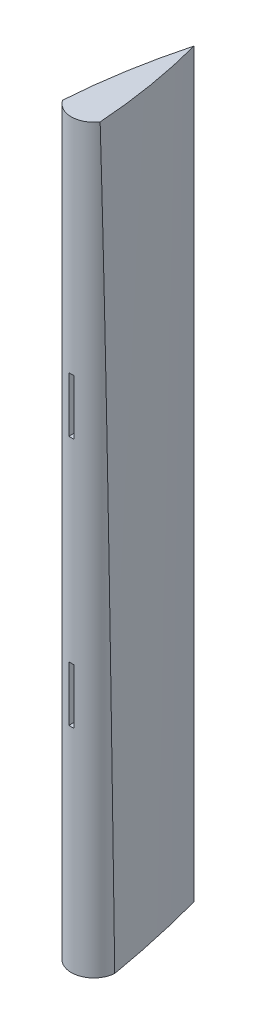
ISO-10303-21;
HEADER;
FILE_DESCRIPTION(('STEP AP214'),'2;1');
FILE_NAME('part.step','',(''),(''),'','','');
FILE_SCHEMA(('AUTOMOTIVE_DESIGN { 1 0 10303 214 1 1 1 1 }'));
ENDSEC;
DATA;
#1=APPLICATION_CONTEXT('core data for automotive mechanical design processes');
#2=APPLICATION_PROTOCOL_DEFINITION('international standard','automotive_design',2000,#1);
#3=PRODUCT_CONTEXT('',#1,'mechanical');
#4=PRODUCT('Part','Part','',(#3));
#5=PRODUCT_RELATED_PRODUCT_CATEGORY('part','',(#4));
#6=PRODUCT_DEFINITION_FORMATION('','',#4);
#7=PRODUCT_DEFINITION_CONTEXT('part definition',#1,'design');
#8=PRODUCT_DEFINITION('design','',#6,#7);
#9=PRODUCT_DEFINITION_SHAPE('','',#8);
#10=(LENGTH_UNIT() NAMED_UNIT(*) SI_UNIT(.MILLI.,.METRE.));
#11=(NAMED_UNIT(*) PLANE_ANGLE_UNIT() SI_UNIT($,.RADIAN.));
#12=(NAMED_UNIT(*) SI_UNIT($,.STERADIAN.) SOLID_ANGLE_UNIT());
#13=UNCERTAINTY_MEASURE_WITH_UNIT(LENGTH_MEASURE(1.E-05),#10,'distance_accuracy_value','');
#14=(GEOMETRIC_REPRESENTATION_CONTEXT(3) GLOBAL_UNCERTAINTY_ASSIGNED_CONTEXT((#13)) GLOBAL_UNIT_ASSIGNED_CONTEXT((#10,
#11,#12)) REPRESENTATION_CONTEXT('',''));
#15=CARTESIAN_POINT('',(0.,0.,0.));
#16=DIRECTION('',(0.,0.,1.));
#17=DIRECTION('',(1.,0.,0.));
#18=AXIS2_PLACEMENT_3D('',#15,#16,#17);
#19=CARTESIAN_POINT('',(0.,170.,96.5));
#20=DIRECTION('',(0.,1.,0.));
#21=DIRECTION('',(0.,0.,1.));
#22=AXIS2_PLACEMENT_3D('',#19,#20,#21);
#23=PLANE('',#22);
#24=CARTESIAN_POINT('',(0.,170.,86.5));
#25=DIRECTION('',(0.,-1.,0.));
#26=DIRECTION('',(0.,0.,-1.));
#27=AXIS2_PLACEMENT_3D('',#24,#25,#26);
#28=CIRCLE('',#27,4.50445274350269);
#29=CARTESIAN_POINT('',(3.74973564692036,170.,88.9959120771101));
#30=VERTEX_POINT('',#29);
#31=CARTESIAN_POINT('',(-3.74973564692016,170.,88.9959120771104));
#32=VERTEX_POINT('',#31);
#33=EDGE_CURVE('E266',#30,#32,#28,.T.);
#34=ORIENTED_EDGE('',*,*,#33,.F.);
#35=CARTESIAN_POINT('',(4.,170.,96.5));
#36=CARTESIAN_POINT('',(4.,170.,81.5));
#37=CARTESIAN_POINT('',(0.,170.,66.5));
#38=B_SPLINE_CURVE_WITH_KNOTS('',2,(#35,#36,#37),.UNSPECIFIED.,.F.,.F.,(3,3),(0.,1.),.UNSPECIFIED.);
#39=CARTESIAN_POINT('',(0.,170.,66.5));
#40=VERTEX_POINT('',#39);
#41=EDGE_CURVE('E215',#30,#40,#38,.T.);
#42=ORIENTED_EDGE('',*,*,#41,.T.);
#43=CARTESIAN_POINT('',(-4.,170.,96.5));
#44=CARTESIAN_POINT('',(-4.,170.,81.5));
#45=CARTESIAN_POINT('',(0.,170.,66.5));
#46=B_SPLINE_CURVE_WITH_KNOTS('',2,(#43,#44,#45),.UNSPECIFIED.,.F.,.F.,(3,3),(0.,1.),.UNSPECIFIED.);
#47=EDGE_CURVE('E214',#32,#40,#46,.T.);
#48=ORIENTED_EDGE('',*,*,#47,.F.);
#49=EDGE_LOOP('',(#34,#42,#48));
#50=FACE_BOUND('',#49,.T.);
#51=ADVANCED_FACE('F40',(#50),#23,.T.);
#52=CARTESIAN_POINT('',(0.,20.,86.5));
#53=DIRECTION('',(0.,1.,0.));
#54=DIRECTION('',(0.,0.,1.));
#55=AXIS2_PLACEMENT_3D('',#52,#53,#54);
#56=CYLINDRICAL_SURFACE('',#55,4.50445274350269);
#57=DIRECTION('',(0.,1.,0.));
#58=VECTOR('',#57,1.);
#59=CARTESIAN_POINT('',(-0.499999999999906,20.,90.9766164140397));
#60=LINE('',#59,#58);
#61=CARTESIAN_POINT('',(-0.499999999999906,125.5,90.9766164140397));
#62=VERTEX_POINT('',#61);
#63=CARTESIAN_POINT('',(-0.499999999999906,114.5,90.9766164140397));
#64=VERTEX_POINT('',#63);
#65=EDGE_CURVE('E324',#62,#64,#60,.F.);
#66=ORIENTED_EDGE('',*,*,#65,.F.);
#67=CARTESIAN_POINT('',(0.,125.5,86.5));
#68=DIRECTION('',(0.,1.,0.));
#69=DIRECTION('',(0.,0.,1.));
#70=AXIS2_PLACEMENT_3D('',#67,#68,#69);
#71=CIRCLE('',#70,4.50445274350269);
#72=CARTESIAN_POINT('',(0.500000000000094,125.5,90.9766164140396));
#73=VERTEX_POINT('',#72);
#74=EDGE_CURVE('E11',#62,#73,#71,.T.);
#75=ORIENTED_EDGE('',*,*,#74,.T.);
#76=DIRECTION('',(0.,1.,0.));
#77=VECTOR('',#76,1.);
#78=CARTESIAN_POINT('',(0.500000000000094,20.,90.9766164140396));
#79=LINE('',#78,#77);
#80=CARTESIAN_POINT('',(0.500000000000094,114.5,90.9766164140396));
#81=VERTEX_POINT('',#80);
#82=EDGE_CURVE('E51',#73,#81,#79,.F.);
#83=ORIENTED_EDGE('',*,*,#82,.T.);
#84=CARTESIAN_POINT('',(0.,114.5,86.5));
#85=DIRECTION('',(0.,1.,0.));
#86=DIRECTION('',(0.,0.,1.));
#87=AXIS2_PLACEMENT_3D('',#84,#85,#86);
#88=CIRCLE('',#87,4.50445274350269);
#89=EDGE_CURVE('E326',#64,#81,#88,.T.);
#90=ORIENTED_EDGE('',*,*,#89,.F.);
#91=EDGE_LOOP('',(#66,#75,#83,#90));
#92=FACE_BOUND('',#91,.T.);
#93=DIRECTION('',(0.,1.,0.));
#94=VECTOR('',#93,1.);
#95=CARTESIAN_POINT('',(-0.499999999999889,20.,90.9766164140397));
#96=LINE('',#95,#94);
#97=CARTESIAN_POINT('',(-0.499999999999889,75.5,90.9766164140397));
#98=VERTEX_POINT('',#97);
#99=CARTESIAN_POINT('',(-0.49999999999989,64.5,90.9766164140397));
#100=VERTEX_POINT('',#99);
#101=EDGE_CURVE('E216',#98,#100,#96,.F.);
#102=ORIENTED_EDGE('',*,*,#101,.F.);
#103=CARTESIAN_POINT('',(0.,75.5,86.5));
#104=DIRECTION('',(0.,1.,0.));
#105=DIRECTION('',(0.,0.,1.));
#106=AXIS2_PLACEMENT_3D('',#103,#104,#105);
#107=CIRCLE('',#106,4.50445274350269);
#108=CARTESIAN_POINT('',(0.50000000000011,75.5,90.9766164140396));
#109=VERTEX_POINT('',#108);
#110=EDGE_CURVE('E319',#98,#109,#107,.T.);
#111=ORIENTED_EDGE('',*,*,#110,.T.);
#112=DIRECTION('',(0.,1.,0.));
#113=VECTOR('',#112,1.);
#114=CARTESIAN_POINT('',(0.50000000000011,20.,90.9766164140396));
#115=LINE('',#114,#113);
#116=CARTESIAN_POINT('',(0.50000000000011,64.5,90.9766164140396));
#117=VERTEX_POINT('',#116);
#118=EDGE_CURVE('E315',#109,#117,#115,.F.);
#119=ORIENTED_EDGE('',*,*,#118,.T.);
#120=CARTESIAN_POINT('',(0.,64.5,86.5));
#121=DIRECTION('',(0.,1.,0.));
#122=DIRECTION('',(0.,0.,1.));
#123=AXIS2_PLACEMENT_3D('',#120,#121,#122);
#124=CIRCLE('',#123,4.50445274350269);
#125=EDGE_CURVE('E312',#100,#117,#124,.T.);
#126=ORIENTED_EDGE('',*,*,#125,.F.);
#127=EDGE_LOOP('',(#102,#111,#119,#126));
#128=FACE_BOUND('',#127,.T.);
#129=CARTESIAN_POINT('',(0.,22.,86.5));
#130=DIRECTION('',(0.,-1.,0.));
#131=DIRECTION('',(0.,0.,-1.));
#132=AXIS2_PLACEMENT_3D('',#129,#130,#131);
#133=CIRCLE('',#132,4.50445274350269);
#134=CARTESIAN_POINT('',(4.49270552710919,22.0000000000284,86.8251023917653));
#135=VERTEX_POINT('',#134);
#136=CARTESIAN_POINT('',(-4.49270552710921,22.,86.8251023917649));
#137=VERTEX_POINT('',#136);
#138=EDGE_CURVE('E305',#135,#137,#133,.T.);
#139=ORIENTED_EDGE('',*,*,#138,.F.);
#140=CARTESIAN_POINT('',(4.49463644337586,20.,86.797216689179));
#141=CARTESIAN_POINT('',(4.49324611615135,21.5013365909766,86.8182325955692));
#142=CARTESIAN_POINT('',(4.49172184768343,23.0026757479804,86.8390546621087));
#143=CARTESIAN_POINT('',(4.48841093930421,26.0053581422894,86.8803848432464));
#144=CARTESIAN_POINT('',(4.48662429938495,27.5067013795947,86.9008929578353));
#145=CARTESIAN_POINT('',(4.48087908795766,32.010736436233,86.9620569761771));
#146=CARTESIAN_POINT('',(4.476535225656,35.0134326618934,87.0023525414618));
#147=CARTESIAN_POINT('',(4.46682299270257,41.018830496669,87.0824155689863));
#148=CARTESIAN_POINT('',(4.46145462203055,44.0215321057843,87.1221830312159));
#149=CARTESIAN_POINT('',(4.44377952498389,53.029637347885,87.2412023744453));
#150=CARTESIAN_POINT('',(4.42990281310395,59.0350417708939,87.3201712169916));
#151=CARTESIAN_POINT('',(4.4018672415971,69.4108560135893,87.4576702431264));
#152=CARTESIAN_POINT('',(4.38881373710263,73.7812726516977,87.5159116828163));
#153=CARTESIAN_POINT('',(4.35988918217684,82.5220801104054,87.6336406669034));
#154=CARTESIAN_POINT('',(4.3440181316633,86.8924709310038,87.6931282113369));
#155=CARTESIAN_POINT('',(4.30902421573481,95.6332205702791,87.8139091254271));
#156=CARTESIAN_POINT('',(4.28990134601869,100.003579388906,87.8752024974724));
#157=CARTESIAN_POINT('',(4.24783410460643,108.744245323533,88.0001151283537));
#158=CARTESIAN_POINT('',(4.22488973322412,113.114552439537,88.0637343869988));
#159=CARTESIAN_POINT('',(4.17444346589508,121.854569740538,88.1938076132548));
#160=CARTESIAN_POINT('',(4.14694212161807,126.224279933791,88.2602612370136));
#161=CARTESIAN_POINT('',(4.08641679578091,134.963611400471,88.3965377746959));
#162=CARTESIAN_POINT('',(4.05339281273624,139.333232673873,88.4663606895251));
#163=CARTESIAN_POINT('',(3.980557119153,148.072343289656,88.609915376404));
#164=CARTESIAN_POINT('',(3.94074542679791,152.441832632358,88.683647137982));
#165=CARTESIAN_POINT('',(3.85265712254613,161.180647711731,88.8355623928345));
#166=CARTESIAN_POINT('',(3.80438051765123,165.549973448534,88.9137458824267));
#167=CARTESIAN_POINT('',(3.75040523683738,169.946124169629,88.9949058950007));
#168=CARTESIAN_POINT('',(3.75007429301951,169.973062086965,88.9954033065976));
#169=CARTESIAN_POINT('',(3.74974314488905,170.,88.9959008124937));
#170=B_SPLINE_CURVE_WITH_KNOTS('',3,(#140,#141,#142,#143,#144,#145,#146,#147,#148,#149,#150,
#151,#152,#153,#154,#155,#156,#157,#158,#159,#160,#161,#162,#163,#164,#165,#166,#167,#168,#169),
.UNSPECIFIED.,.F.,.F.,(4,2,2,2,2,2,2,2,2,2,2,2,2,2,4),(0.,4.50445290300543,9.00890594252304,
18.0178148370163,27.0267239095406,45.0445409286816,58.1570126515752,71.2694847571101,
84.3819742065918,97.4944625792762,110.605364704911,123.716270354844,136.82714088278,
149.938000566049,150.018834191428),.UNSPECIFIED.);
#171=EDGE_CURVE('E271',#135,#30,#170,.T.);
#172=ORIENTED_EDGE('',*,*,#171,.T.);
#173=ORIENTED_EDGE('',*,*,#33,.T.);
#174=CARTESIAN_POINT('',(-3.74974314488914,170.,88.9959008124933));
#175=CARTESIAN_POINT('',(-3.76819510449323,168.498884020559,88.9681770972164));
#176=CARTESIAN_POINT('',(-3.78601169028676,166.997754969201,88.9407461706218));
#177=CARTESIAN_POINT('',(-3.8204696883343,163.995473607015,88.8864496106249));
#178=CARTESIAN_POINT('',(-3.83711110095252,162.494321296193,88.8595839770472));
#179=CARTESIAN_POINT('',(-3.8854160716347,157.990821680486,88.7798043741134));
#180=CARTESIAN_POINT('',(-3.915460232064,154.988442416944,88.7277079003352));
#181=CARTESIAN_POINT('',(-3.97185615517319,148.983614867033,88.6255228862658));
#182=CARTESIAN_POINT('',(-3.99820791696678,145.981166580648,88.5754343464565));
#183=CARTESIAN_POINT('',(-4.07252097185096,136.973731880631,88.4279153174129));
#184=CARTESIAN_POINT('',(-4.11573997857941,130.968661020375,88.3332315134902));
#185=CARTESIAN_POINT('',(-4.17912139538496,121.067572771949,88.1820097737817));
#186=CARTESIAN_POINT('',(-4.20205035108585,117.171598230993,88.1237543648514));
#187=CARTESIAN_POINT('',(-4.24448196812442,109.37959885702,88.0093702503424));
#188=CARTESIAN_POINT('',(-4.2639846292016,105.483574023999,87.9532415449254));
#189=CARTESIAN_POINT('',(-4.30005837331471,97.6914858637677,87.8427458521934));
#190=CARTESIAN_POINT('',(-4.31662945620337,93.7954225365549,87.7883788649669));
#191=CARTESIAN_POINT('',(-4.34722517752018,86.0032669470963,87.6810342149983));
#192=CARTESIAN_POINT('',(-4.36124981601423,82.1071746848512,87.6280565522201));
#193=CARTESIAN_POINT('',(-4.39022239493888,73.3601666444535,87.5102346909263));
#194=CARTESIAN_POINT('',(-4.4045543220063,68.5092451586463,87.4456641074348));
#195=CARTESIAN_POINT('',(-4.43018285493534,58.8073847035413,87.3172304124278));
#196=CARTESIAN_POINT('',(-4.44147946066184,53.9564457342429,87.2533673009439));
#197=CARTESIAN_POINT('',(-4.45635086284768,46.6800406023461,87.1573249940805));
#198=CARTESIAN_POINT('',(-4.46096240941608,44.2545748772233,87.125269646361));
#199=CARTESIAN_POINT('',(-4.46951110352355,39.4036455662924,87.0609094760222));
#200=CARTESIAN_POINT('',(-4.4734482510703,36.9781819804842,87.0286046534056));
#201=CARTESIAN_POINT('',(-4.4806568849815,32.1272598874642,86.9635542483466));
#202=CARTESIAN_POINT('',(-4.48392837139554,29.701801380252,86.9308086659371));
#203=CARTESIAN_POINT('',(-4.4897936682541,24.8508931152665,86.8646099937506));
#204=CARTESIAN_POINT('',(-4.49238747867073,22.4254433574934,86.8311569039446));
#205=CARTESIAN_POINT('',(-4.49463644337586,20.,86.797216689179));
#206=B_SPLINE_CURVE_WITH_KNOTS('',3,(#174,#175,#176,#177,#178,#179,#180,#181,#182,#183,#184,
#185,#186,#187,#188,#189,#190,#191,#192,#193,#194,#195,#196,#197,#198,#199,#200,#201,#202,#203,
#204,#205),.UNSPECIFIED.,.F.,.F.,(4,2,2,2,2,2,2,2,2,2,2,2,2,2,2,4),(0.,4.50445565239495,
9.00890990876309,18.0178506030638,27.0267934598059,45.0446953593323,56.7341262935253,
68.4235581164091,80.1129905265462,91.8024226341653,106.356538548724,120.910655111136,
128.187700800217,135.464746406541,142.741791470756,150.018836834383),.UNSPECIFIED.);
#207=EDGE_CURVE('E240',#32,#137,#206,.T.);
#208=ORIENTED_EDGE('',*,*,#207,.T.);
#209=EDGE_LOOP('',(#139,#172,#173,#208));
#210=FACE_BOUND('',#209,.T.);
#211=ADVANCED_FACE('F200',(#92,#128,#210),#56,.T.);
#212=CARTESIAN_POINT('',(0.,0.,66.5));
#213=CARTESIAN_POINT('',(0.,56.6666666666667,66.5));
#214=CARTESIAN_POINT('',(0.,113.333333333333,66.5));
#215=CARTESIAN_POINT('',(0.,170.,66.5));
#216=CARTESIAN_POINT('',(-1.30245716316965,0.,71.3028107891881));
#217=CARTESIAN_POINT('',(-1.08554198762785,56.6666666666667,70.5165134051391));
#218=CARTESIAN_POINT('',(-0.868626812086048,113.333333333333,69.73021602109));
#219=CARTESIAN_POINT('',(-0.651711636544246,170.,68.943918637041));
#220=CARTESIAN_POINT('',(-3.60999981867831,0.,80.98563710704));
#221=CARTESIAN_POINT('',(-3.00892422202832,56.6666666666667,78.6148522260634));
#222=CARTESIAN_POINT('',(-2.40784862537832,113.333333333333,76.2440673450868));
#223=CARTESIAN_POINT('',(-1.80677302872833,170.,73.8732824641101));
#224=CARTESIAN_POINT('',(-6.12693045498558,0.,95.700940806144));
#225=CARTESIAN_POINT('',(-5.10655083308295,56.6666666666667,90.9220308440304));
#226=CARTESIAN_POINT('',(-4.08617121118032,113.333333333333,86.1431208819168));
#227=CARTESIAN_POINT('',(-3.06579158927769,170.,81.3642109198033));
#228=CARTESIAN_POINT('',(-7.6571301959301,0.,110.557077232018));
#229=CARTESIAN_POINT('',(-6.38129393365213,56.6666666666666,103.344453572357));
#230=CARTESIAN_POINT('',(-5.10545767137415,113.333333333333,96.1318299126951));
#231=CARTESIAN_POINT('',(-3.82962140909618,170.,88.9192062530334));
#232=CARTESIAN_POINT('',(-8.,0.,120.516654934178));
#233=CARTESIAN_POINT('',(-6.66666666666667,56.6666666666667,111.669189393747));
#234=CARTESIAN_POINT('',(-5.33333333333333,113.333333333333,102.821723853316));
#235=CARTESIAN_POINT('',(-4.,170.,93.9742583128852));
#236=CARTESIAN_POINT('',(-8.,0.,126.540134839831));
#237=CARTESIAN_POINT('',(-6.66666666666667,56.6666666666667,116.702482696347));
#238=CARTESIAN_POINT('',(-5.33333333333333,113.333333333333,106.864830552862));
#239=CARTESIAN_POINT('',(-4.,170.,97.027178409378));
#240=CARTESIAN_POINT('',(-7.58920231771033,0.,128.627479332831));
#241=CARTESIAN_POINT('',(-6.32256414699206,56.6666666666667,118.444155574602));
#242=CARTESIAN_POINT('',(-5.05592597627379,113.333333333333,108.260831816373));
#243=CARTESIAN_POINT('',(-3.78928780555552,170.,98.0775080581438));
#244=CARTESIAN_POINT('',(-5.81336309831473,0.,131.296468991079));
#245=CARTESIAN_POINT('',(-4.84143972386072,56.6666666666666,120.666310102981));
#246=CARTESIAN_POINT('',(-3.86951634940672,113.333333333333,110.036151214882));
#247=CARTESIAN_POINT('',(-2.89759297495271,170.,99.4059923267827));
#248=CARTESIAN_POINT('',(-3.14498817547013,0.,133.083551957018));
#249=CARTESIAN_POINT('',(-2.61957745119133,56.6666666666667,122.153083212068));
#250=CARTESIAN_POINT('',(-2.09416672691253,113.333333333333,111.222614467118));
#251=CARTESIAN_POINT('',(-1.56875600263372,170.,100.292145722168));
#252=CARTESIAN_POINT('',(-1.04719754438289,0.,133.5));
#253=CARTESIAN_POINT('',(-0.872664620319073,56.6666666666667,122.5));
#254=CARTESIAN_POINT('',(-0.698131696255256,113.333333333333,111.5));
#255=CARTESIAN_POINT('',(-0.52359877219144,170.,100.5));
#256=CARTESIAN_POINT('',(0.,0.,133.5));
#257=CARTESIAN_POINT('',(0.,56.6666666666667,122.5));
#258=CARTESIAN_POINT('',(0.,113.333333333333,111.5));
#259=CARTESIAN_POINT('',(0.,170.,100.5));
#260=B_SPLINE_SURFACE_WITH_KNOTS('',3,3,((#212,#213,#214,#215),(#216,#217,#218,#219),(#220,#221,
#222,#223),(#224,#225,#226,#227),(#228,#229,#230,#231),(#232,#233,#234,#235),(#236,#237,#238,
#239),(#240,#241,#242,#243),(#244,#245,#246,#247),(#248,#249,#250,#251),(#252,#253,#254,#255),
(#256,#257,#258,#259)),.UNSPECIFIED.,.F.,.F.,.F.,(4,1,1,1,2,1,1,1,4),(4,4),(0.,0.10341499304136,
0.20682998608272,0.31024497912408,0.41365997216544,0.43524497912408,0.45682998608272,
0.47841499304136,0.5),(0.,1.),.UNSPECIFIED.);
#261=CARTESIAN_POINT('',(0.,0.,66.5));
#262=CARTESIAN_POINT('',(0.,56.6666666666667,66.5));
#263=CARTESIAN_POINT('',(0.,113.333333333333,66.5));
#264=CARTESIAN_POINT('',(0.,170.,66.5));
#265=B_SPLINE_CURVE_WITH_KNOTS('',3,(#261,#262,#263,#264),.UNSPECIFIED.,.F.,.F.,(4,4),(0.,1.),.UNSPECIFIED.);
#266=CARTESIAN_POINT('',(1.58957291773731E-08,22.,66.499999941243));
#267=VERTEX_POINT('',#266);
#268=EDGE_CURVE('E211',#267,#40,#265,.T.);
#269=CARTESIAN_POINT('',(0.,22.,66.5));
#270=CARTESIAN_POINT('',(-0.204196817663707,22.,67.2538591320361));
#271=CARTESIAN_POINT('',(-0.404496989936602,22.,68.0087744680544));
#272=CARTESIAN_POINT('',(-0.797111559789184,22.,69.5202211038593));
#273=CARTESIAN_POINT('',(-0.989430428358535,22.,70.2767512423231));
#274=CARTESIAN_POINT('',(-1.36603538844595,22.,71.7914390091773));
#275=CARTESIAN_POINT('',(-1.55032513484789,22.,72.5495957286923));
#276=CARTESIAN_POINT('',(-1.91082178461146,22.,74.0675483988521));
#277=CARTESIAN_POINT('',(-2.08703149320491,22.,74.8273436832158));
#278=CARTESIAN_POINT('',(-2.43131502058955,22.,76.3485860903812));
#279=CARTESIAN_POINT('',(-2.59939075933179,22.,77.1100327786097));
#280=CARTESIAN_POINT('',(-2.92735009521612,22.,78.6345913537089));
#281=CARTESIAN_POINT('',(-3.08723468934102,22.,79.3977030260821));
#282=CARTESIAN_POINT('',(-3.39875689836038,22.,80.9256257324776));
#283=CARTESIAN_POINT('',(-3.55039432956466,22.,81.6904368039563));
#284=CARTESIAN_POINT('',(-3.84537153411693,22.,83.2217454964744));
#285=CARTESIAN_POINT('',(-3.98871038596972,22.,83.9882432950403));
#286=CARTESIAN_POINT('',(-4.26704039428219,22.,85.5229339760401));
#287=CARTESIAN_POINT('',(-4.40202963705225,22.,86.2911272055814));
#288=CARTESIAN_POINT('',(-4.66360683620004,22.,87.8292178596223));
#289=CARTESIAN_POINT('',(-4.79019185324581,22.,88.5991157840591));
#290=CARTESIAN_POINT('',(-5.03490323095779,22.,90.1406257288566));
#291=CARTESIAN_POINT('',(-5.15302559086815,22.,90.9122383844513));
#292=CARTESIAN_POINT('',(-5.38075059330338,22.,92.4571878975243));
#293=CARTESIAN_POINT('',(-5.49034813555736,22.,93.2305255067282));
#294=CARTESIAN_POINT('',(-5.59561527343388,22.,94.004452743504));
#295=B_SPLINE_CURVE_WITH_KNOTS('',3,(#269,#270,#271,#272,#273,#274,#275,#276,#277,#278,#279,
#280,#281,#282,#283,#284,#285,#286,#287,#288,#289,#290,#291,#292,#293,#294),.UNSPECIFIED.,.F.,
.F.,(4,2,2,2,2,2,2,2,2,2,2,2,4),(0.,2.34306536392264,4.68479995995476,7.02545720870046,
9.36529557693775,11.7045789261459,14.0435768703932,16.3826268901414,18.7219361476925,
21.0617795918383,23.4024371187715,25.7441939974228,28.087341306642),.UNSPECIFIED.);
#296=EDGE_CURVE('E155',#267,#137,#295,.T.);
#297=ORIENTED_EDGE('',*,*,#268,.F.);
#298=ORIENTED_EDGE('',*,*,#296,.T.);
#299=ORIENTED_EDGE('',*,*,#207,.F.);
#300=ORIENTED_EDGE('',*,*,#47,.T.);
#301=EDGE_LOOP('',(#297,#298,#299,#300));
#302=FACE_BOUND('',#301,.T.);
#303=ADVANCED_FACE('F42',(#302),#260,.T.);
#304=CARTESIAN_POINT('',(0.,0.,133.5));
#305=CARTESIAN_POINT('',(0.,56.6666666666667,122.5));
#306=CARTESIAN_POINT('',(0.,113.333333333333,111.5));
#307=CARTESIAN_POINT('',(0.,170.,100.5));
#308=CARTESIAN_POINT('',(1.04719754438289,0.,133.5));
#309=CARTESIAN_POINT('',(0.872664620319073,56.6666666666667,122.5));
#310=CARTESIAN_POINT('',(0.698131696255257,113.333333333333,111.5));
#311=CARTESIAN_POINT('',(0.52359877219144,170.,100.5));
#312=CARTESIAN_POINT('',(3.14498817547013,0.,133.083551957018));
#313=CARTESIAN_POINT('',(2.61957745119133,56.6666666666667,122.153083212068));
#314=CARTESIAN_POINT('',(2.09416672691253,113.333333333333,111.222614467118));
#315=CARTESIAN_POINT('',(1.56875600263373,170.,100.292145722168));
#316=CARTESIAN_POINT('',(5.81336309831469,0.,131.296468991079));
#317=CARTESIAN_POINT('',(4.8414397238607,56.6666666666666,120.66631010298));
#318=CARTESIAN_POINT('',(3.86951634940671,113.333333333333,110.036151214882));
#319=CARTESIAN_POINT('',(2.89759297495271,170.,99.405992326783));
#320=CARTESIAN_POINT('',(7.58920231771033,0.,128.627479332832));
#321=CARTESIAN_POINT('',(6.32256414699206,56.6666666666667,118.444155574602));
#322=CARTESIAN_POINT('',(5.0559259762738,113.333333333333,108.260831816373));
#323=CARTESIAN_POINT('',(3.78928780555553,170.,98.0775080581436));
#324=CARTESIAN_POINT('',(8.,0.,126.540134839831));
#325=CARTESIAN_POINT('',(6.66666666666667,56.6666666666667,116.702482696347));
#326=CARTESIAN_POINT('',(5.33333333333334,113.333333333333,106.864830552862));
#327=CARTESIAN_POINT('',(4.,170.,97.0271784093779));
#328=CARTESIAN_POINT('',(8.,0.,120.516654934178));
#329=CARTESIAN_POINT('',(6.66666666666667,56.6666666666667,111.669189393747));
#330=CARTESIAN_POINT('',(5.33333333333333,113.333333333333,102.821723853316));
#331=CARTESIAN_POINT('',(4.,170.,93.9742583128852));
#332=CARTESIAN_POINT('',(7.65713019593011,0.,110.557077232018));
#333=CARTESIAN_POINT('',(6.38129393365213,56.6666666666666,103.344453572357));
#334=CARTESIAN_POINT('',(5.10545767137415,113.333333333333,96.131829912695));
#335=CARTESIAN_POINT('',(3.82962140909618,170.,88.9192062530334));
#336=CARTESIAN_POINT('',(6.12693045498559,0.,95.7009408061443));
#337=CARTESIAN_POINT('',(5.10655083308296,56.6666666666667,90.9220308440306));
#338=CARTESIAN_POINT('',(4.08617121118033,113.333333333333,86.1431208819169));
#339=CARTESIAN_POINT('',(3.0657915892777,170.,81.3642109198032));
#340=CARTESIAN_POINT('',(3.6099998186783,0.,80.9856371070398));
#341=CARTESIAN_POINT('',(3.00892422202831,56.6666666666666,78.6148522260632));
#342=CARTESIAN_POINT('',(2.40784862537832,113.333333333333,76.2440673450867));
#343=CARTESIAN_POINT('',(1.80677302872833,170.,73.8732824641101));
#344=CARTESIAN_POINT('',(1.30245716316965,0.,71.3028107891881));
#345=CARTESIAN_POINT('',(1.08554198762785,56.6666666666667,70.5165134051391));
#346=CARTESIAN_POINT('',(0.868626812086049,113.333333333333,69.73021602109));
#347=CARTESIAN_POINT('',(0.651711636544247,170.,68.943918637041));
#348=CARTESIAN_POINT('',(0.,0.,66.5));
#349=CARTESIAN_POINT('',(0.,56.6666666666667,66.5));
#350=CARTESIAN_POINT('',(0.,113.333333333333,66.5));
#351=CARTESIAN_POINT('',(0.,170.,66.5));
#352=B_SPLINE_SURFACE_WITH_KNOTS('',3,3,((#304,#305,#306,#307),(#308,#309,#310,#311),(#312,#313,
#314,#315),(#316,#317,#318,#319),(#320,#321,#322,#323),(#324,#325,#326,#327),(#328,#329,#330,
#331),(#332,#333,#334,#335),(#336,#337,#338,#339),(#340,#341,#342,#343),(#344,#345,#346,#347),
(#348,#349,#350,#351)),.UNSPECIFIED.,.F.,.F.,.F.,(4,1,1,1,2,1,1,1,4),(4,4),(0.5,
0.52158500695864,0.54317001391728,0.56475502087592,0.58634002783456,0.68975502087592,
0.79317001391728,0.89658500695864,1.),(0.,1.),.UNSPECIFIED.);
#353=CARTESIAN_POINT('',(5.59561527343387,22.,94.004452743504));
#354=CARTESIAN_POINT('',(5.49034813555734,22.,93.2305255067282));
#355=CARTESIAN_POINT('',(5.38075059330336,22.,92.4571878975243));
#356=CARTESIAN_POINT('',(5.15302559086814,22.,90.9122383844513));
#357=CARTESIAN_POINT('',(5.03490323095778,22.,90.1406257288566));
#358=CARTESIAN_POINT('',(4.79019185324581,22.,88.5991157840591));
#359=CARTESIAN_POINT('',(4.66360683620004,22.,87.8292178596223));
#360=CARTESIAN_POINT('',(4.40202963705225,22.,86.2911272055814));
#361=CARTESIAN_POINT('',(4.26704039428218,22.,85.5229339760401));
#362=CARTESIAN_POINT('',(3.98871038596972,22.,83.9882432950404));
#363=CARTESIAN_POINT('',(3.84537153411695,22.,83.2217454964744));
#364=CARTESIAN_POINT('',(3.55039432956469,22.,81.6904368039563));
#365=CARTESIAN_POINT('',(3.3987568983604,22.,80.9256257324777));
#366=CARTESIAN_POINT('',(3.08723468934103,22.,79.3977030260821));
#367=CARTESIAN_POINT('',(2.92735009521614,22.,78.6345913537089));
#368=CARTESIAN_POINT('',(2.59939075933181,22.,77.1100327786097));
#369=CARTESIAN_POINT('',(2.43131502058956,22.,76.3485860903812));
#370=CARTESIAN_POINT('',(2.08703149320493,22.,74.8273436832158));
#371=CARTESIAN_POINT('',(1.91082178461148,22.,74.0675483988521));
#372=CARTESIAN_POINT('',(1.55032513484791,22.,72.5495957286923));
#373=CARTESIAN_POINT('',(1.36603538844596,22.,71.7914390091773));
#374=CARTESIAN_POINT('',(0.989430428358536,22.,70.2767512423231));
#375=CARTESIAN_POINT('',(0.79711155978919,22.,69.5202211038593));
#376=CARTESIAN_POINT('',(0.404496989936613,22.,68.0087744680544));
#377=CARTESIAN_POINT('',(0.204196817663718,22.,67.2538591320361));
#378=CARTESIAN_POINT('',(0.,22.,66.5));
#379=B_SPLINE_CURVE_WITH_KNOTS('',3,(#353,#354,#355,#356,#357,#358,#359,#360,#361,#362,#363,
#364,#365,#366,#367,#368,#369,#370,#371,#372,#373,#374,#375,#376,#377,#378),.UNSPECIFIED.,.F.,
.F.,(4,2,2,2,2,2,2,2,2,2,2,2,4),(0.,2.34314730921921,4.68490418787053,7.0255617148037,
9.3654051589495,11.7047144165006,14.0437644362488,16.3827623804961,18.7220457297043,
21.0618840979416,23.4025413466873,25.7442759427194,28.0873413066421),.UNSPECIFIED.);
#380=EDGE_CURVE('E272',#135,#267,#379,.T.);
#381=ORIENTED_EDGE('',*,*,#171,.F.);
#382=ORIENTED_EDGE('',*,*,#380,.T.);
#383=ORIENTED_EDGE('',*,*,#268,.T.);
#384=ORIENTED_EDGE('',*,*,#41,.F.);
#385=EDGE_LOOP('',(#381,#382,#383,#384));
#386=FACE_BOUND('',#385,.T.);
#387=ADVANCED_FACE('F186',(#386),#352,.T.);
#388=CARTESIAN_POINT('',(8.0000000000382,22.,125.499999999999));
#389=DIRECTION('',(0.,-1.,0.));
#390=DIRECTION('',(0.,0.,-1.));
#391=AXIS2_PLACEMENT_3D('',#388,#389,#390);
#392=PLANE('',#391);
#393=ORIENTED_EDGE('',*,*,#138,.T.);
#394=ORIENTED_EDGE('',*,*,#296,.F.);
#395=ORIENTED_EDGE('',*,*,#380,.F.);
#396=EDGE_LOOP('',(#393,#394,#395));
#397=FACE_BOUND('',#396,.T.);
#398=ADVANCED_FACE('F191',(#397),#392,.T.);
#399=CARTESIAN_POINT('',(0.500000000000243,75.5,81.0044527435028));
#400=DIRECTION('',(0.,1.,0.));
#401=DIRECTION('',(0.,0.,1.));
#402=AXIS2_PLACEMENT_3D('',#399,#400,#401);
#403=PLANE('',#402);
#404=DIRECTION('',(0.,0.,1.));
#405=VECTOR('',#404,1.);
#406=CARTESIAN_POINT('',(-0.499999999999757,75.5,81.0044527435028));
#407=LINE('',#406,#405);
#408=CARTESIAN_POINT('',(-0.499999999999757,75.5,81.0044527435028));
#409=VERTEX_POINT('',#408);
#410=EDGE_CURVE('E66',#409,#98,#407,.T.);
#411=ORIENTED_EDGE('',*,*,#410,.F.);
#412=DIRECTION('',(-1.,0.,0.));
#413=VECTOR('',#412,1.);
#414=CARTESIAN_POINT('',(0.500000000000243,75.5,81.0044527435028));
#415=LINE('',#414,#413);
#416=CARTESIAN_POINT('',(0.500000000000243,75.5,81.0044527435028));
#417=VERTEX_POINT('',#416);
#418=EDGE_CURVE('E145',#417,#409,#415,.T.);
#419=ORIENTED_EDGE('',*,*,#418,.F.);
#420=DIRECTION('',(0.,0.,1.));
#421=VECTOR('',#420,1.);
#422=CARTESIAN_POINT('',(0.500000000000243,75.5,81.0044527435028));
#423=LINE('',#422,#421);
#424=EDGE_CURVE('E168',#417,#109,#423,.T.);
#425=ORIENTED_EDGE('',*,*,#424,.T.);
#426=ORIENTED_EDGE('',*,*,#110,.F.);
#427=EDGE_LOOP('',(#411,#419,#425,#426));
#428=FACE_BOUND('',#427,.T.);
#429=ADVANCED_FACE('F196',(#428),#403,.F.);
#430=CARTESIAN_POINT('',(0.500000000000243,64.5,81.0044527435028));
#431=DIRECTION('',(1.,0.,0.));
#432=DIRECTION('',(0.,0.,-1.));
#433=AXIS2_PLACEMENT_3D('',#430,#431,#432);
#434=PLANE('',#433);
#435=ORIENTED_EDGE('',*,*,#424,.F.);
#436=DIRECTION('',(0.,1.,0.));
#437=VECTOR('',#436,1.);
#438=CARTESIAN_POINT('',(0.500000000000243,64.5,81.0044527435028));
#439=LINE('',#438,#437);
#440=CARTESIAN_POINT('',(0.500000000000243,64.5,81.0044527435028));
#441=VERTEX_POINT('',#440);
#442=EDGE_CURVE('E161',#441,#417,#439,.T.);
#443=ORIENTED_EDGE('',*,*,#442,.F.);
#444=DIRECTION('',(0.,0.,1.));
#445=VECTOR('',#444,1.);
#446=CARTESIAN_POINT('',(0.500000000000243,64.5,81.0044527435028));
#447=LINE('',#446,#445);
#448=EDGE_CURVE('E165',#441,#117,#447,.T.);
#449=ORIENTED_EDGE('',*,*,#448,.T.);
#450=ORIENTED_EDGE('',*,*,#118,.F.);
#451=EDGE_LOOP('',(#435,#443,#449,#450));
#452=FACE_BOUND('',#451,.T.);
#453=ADVANCED_FACE('F349',(#452),#434,.F.);
#454=CARTESIAN_POINT('',(0.500000000000243,64.5,81.0044527435028));
#455=DIRECTION('',(0.,1.,0.));
#456=DIRECTION('',(0.,0.,1.));
#457=AXIS2_PLACEMENT_3D('',#454,#455,#456);
#458=PLANE('',#457);
#459=ORIENTED_EDGE('',*,*,#125,.T.);
#460=ORIENTED_EDGE('',*,*,#448,.F.);
#461=DIRECTION('',(-1.,0.,0.));
#462=VECTOR('',#461,1.);
#463=CARTESIAN_POINT('',(0.500000000000243,64.5,81.0044527435028));
#464=LINE('',#463,#462);
#465=CARTESIAN_POINT('',(-0.499999999999757,64.5,81.0044527435028));
#466=VERTEX_POINT('',#465);
#467=EDGE_CURVE('E173',#441,#466,#464,.T.);
#468=ORIENTED_EDGE('',*,*,#467,.T.);
#469=DIRECTION('',(0.,0.,1.));
#470=VECTOR('',#469,1.);
#471=CARTESIAN_POINT('',(-0.499999999999757,64.5,81.0044527435028));
#472=LINE('',#471,#470);
#473=EDGE_CURVE('E162',#466,#100,#472,.T.);
#474=ORIENTED_EDGE('',*,*,#473,.T.);
#475=EDGE_LOOP('',(#459,#460,#468,#474));
#476=FACE_BOUND('',#475,.T.);
#477=ADVANCED_FACE('F354',(#476),#458,.T.);
#478=CARTESIAN_POINT('',(-0.499999999999757,64.5,81.0044527435028));
#479=DIRECTION('',(1.,0.,0.));
#480=DIRECTION('',(0.,0.,-1.));
#481=AXIS2_PLACEMENT_3D('',#478,#479,#480);
#482=PLANE('',#481);
#483=ORIENTED_EDGE('',*,*,#101,.T.);
#484=ORIENTED_EDGE('',*,*,#473,.F.);
#485=DIRECTION('',(0.,1.,0.));
#486=VECTOR('',#485,1.);
#487=CARTESIAN_POINT('',(-0.499999999999757,64.5,81.0044527435028));
#488=LINE('',#487,#486);
#489=EDGE_CURVE('E148',#466,#409,#488,.T.);
#490=ORIENTED_EDGE('',*,*,#489,.T.);
#491=ORIENTED_EDGE('',*,*,#410,.T.);
#492=EDGE_LOOP('',(#483,#484,#490,#491));
#493=FACE_BOUND('',#492,.T.);
#494=ADVANCED_FACE('F351',(#493),#482,.T.);
#495=CARTESIAN_POINT('',(1.7346429764336E-13,0.,81.0044527435028));
#496=DIRECTION('',(0.,0.,-1.));
#497=DIRECTION('',(-1.,0.,0.));
#498=AXIS2_PLACEMENT_3D('',#495,#496,#497);
#499=PLANE('',#498);
#500=ORIENTED_EDGE('',*,*,#418,.T.);
#501=ORIENTED_EDGE('',*,*,#489,.F.);
#502=ORIENTED_EDGE('',*,*,#467,.F.);
#503=ORIENTED_EDGE('',*,*,#442,.T.);
#504=EDGE_LOOP('',(#500,#501,#502,#503));
#505=FACE_BOUND('',#504,.T.);
#506=ADVANCED_FACE('F198',(#505),#499,.F.);
#507=CARTESIAN_POINT('',(0.500000000000227,125.5,81.0044527435028));
#508=DIRECTION('',(0.,1.,0.));
#509=DIRECTION('',(0.,0.,1.));
#510=AXIS2_PLACEMENT_3D('',#507,#508,#509);
#511=PLANE('',#510);
#512=DIRECTION('',(0.,0.,1.));
#513=VECTOR('',#512,1.);
#514=CARTESIAN_POINT('',(-0.499999999999773,125.5,81.0044527435028));
#515=LINE('',#514,#513);
#516=CARTESIAN_POINT('',(-0.499999999999773,125.5,81.0044527435028));
#517=VERTEX_POINT('',#516);
#518=EDGE_CURVE('E58',#517,#62,#515,.T.);
#519=ORIENTED_EDGE('',*,*,#518,.F.);
#520=DIRECTION('',(-1.,0.,0.));
#521=VECTOR('',#520,1.);
#522=CARTESIAN_POINT('',(0.500000000000227,125.5,81.0044527435028));
#523=LINE('',#522,#521);
#524=CARTESIAN_POINT('',(0.500000000000227,125.5,81.0044527435028));
#525=VERTEX_POINT('',#524);
#526=EDGE_CURVE('E133',#525,#517,#523,.T.);
#527=ORIENTED_EDGE('',*,*,#526,.F.);
#528=DIRECTION('',(0.,0.,1.));
#529=VECTOR('',#528,1.);
#530=CARTESIAN_POINT('',(0.500000000000227,125.5,81.0044527435028));
#531=LINE('',#530,#529);
#532=EDGE_CURVE('E153',#525,#73,#531,.T.);
#533=ORIENTED_EDGE('',*,*,#532,.T.);
#534=ORIENTED_EDGE('',*,*,#74,.F.);
#535=EDGE_LOOP('',(#519,#527,#533,#534));
#536=FACE_BOUND('',#535,.T.);
#537=ADVANCED_FACE('F137',(#536),#511,.F.);
#538=CARTESIAN_POINT('',(0.500000000000227,114.5,81.0044527435028));
#539=DIRECTION('',(1.,0.,0.));
#540=DIRECTION('',(0.,0.,-1.));
#541=AXIS2_PLACEMENT_3D('',#538,#539,#540);
#542=PLANE('',#541);
#543=ORIENTED_EDGE('',*,*,#532,.F.);
#544=DIRECTION('',(0.,1.,0.));
#545=VECTOR('',#544,1.);
#546=CARTESIAN_POINT('',(0.500000000000227,114.5,81.0044527435028));
#547=LINE('',#546,#545);
#548=CARTESIAN_POINT('',(0.500000000000227,114.5,81.0044527435028));
#549=VERTEX_POINT('',#548);
#550=EDGE_CURVE('E141',#549,#525,#547,.T.);
#551=ORIENTED_EDGE('',*,*,#550,.F.);
#552=DIRECTION('',(0.,0.,1.));
#553=VECTOR('',#552,1.);
#554=CARTESIAN_POINT('',(0.500000000000227,114.5,81.0044527435028));
#555=LINE('',#554,#553);
#556=EDGE_CURVE('E156',#549,#81,#555,.T.);
#557=ORIENTED_EDGE('',*,*,#556,.T.);
#558=ORIENTED_EDGE('',*,*,#82,.F.);
#559=EDGE_LOOP('',(#543,#551,#557,#558));
#560=FACE_BOUND('',#559,.T.);
#561=ADVANCED_FACE('F331',(#560),#542,.F.);
#562=CARTESIAN_POINT('',(0.500000000000227,114.5,81.0044527435028));
#563=DIRECTION('',(0.,1.,0.));
#564=DIRECTION('',(0.,0.,1.));
#565=AXIS2_PLACEMENT_3D('',#562,#563,#564);
#566=PLANE('',#565);
#567=ORIENTED_EDGE('',*,*,#89,.T.);
#568=ORIENTED_EDGE('',*,*,#556,.F.);
#569=DIRECTION('',(-1.,0.,0.));
#570=VECTOR('',#569,1.);
#571=CARTESIAN_POINT('',(0.500000000000227,114.5,81.0044527435028));
#572=LINE('',#571,#570);
#573=CARTESIAN_POINT('',(-0.499999999999773,114.5,81.0044527435028));
#574=VERTEX_POINT('',#573);
#575=EDGE_CURVE('E132',#549,#574,#572,.T.);
#576=ORIENTED_EDGE('',*,*,#575,.T.);
#577=DIRECTION('',(0.,0.,1.));
#578=VECTOR('',#577,1.);
#579=CARTESIAN_POINT('',(-0.499999999999773,114.5,81.0044527435028));
#580=LINE('',#579,#578);
#581=EDGE_CURVE('E128',#574,#64,#580,.T.);
#582=ORIENTED_EDGE('',*,*,#581,.T.);
#583=EDGE_LOOP('',(#567,#568,#576,#582));
#584=FACE_BOUND('',#583,.T.);
#585=ADVANCED_FACE('F333',(#584),#566,.T.);
#586=CARTESIAN_POINT('',(-0.499999999999773,114.5,81.0044527435028));
#587=DIRECTION('',(1.,0.,0.));
#588=DIRECTION('',(0.,0.,-1.));
#589=AXIS2_PLACEMENT_3D('',#586,#587,#588);
#590=PLANE('',#589);
#591=ORIENTED_EDGE('',*,*,#65,.T.);
#592=ORIENTED_EDGE('',*,*,#581,.F.);
#593=DIRECTION('',(0.,1.,0.));
#594=VECTOR('',#593,1.);
#595=CARTESIAN_POINT('',(-0.499999999999773,114.5,81.0044527435028));
#596=LINE('',#595,#594);
#597=EDGE_CURVE('E125',#574,#517,#596,.T.);
#598=ORIENTED_EDGE('',*,*,#597,.T.);
#599=ORIENTED_EDGE('',*,*,#518,.T.);
#600=EDGE_LOOP('',(#591,#592,#598,#599));
#601=FACE_BOUND('',#600,.T.);
#602=ADVANCED_FACE('F126',(#601),#590,.T.);
#603=CARTESIAN_POINT('',(1.7346429764336E-13,0.,81.0044527435028));
#604=DIRECTION('',(0.,0.,-1.));
#605=DIRECTION('',(-1.,0.,0.));
#606=AXIS2_PLACEMENT_3D('',#603,#604,#605);
#607=PLANE('',#606);
#608=ORIENTED_EDGE('',*,*,#526,.T.);
#609=ORIENTED_EDGE('',*,*,#597,.F.);
#610=ORIENTED_EDGE('',*,*,#575,.F.);
#611=ORIENTED_EDGE('',*,*,#550,.T.);
#612=EDGE_LOOP('',(#608,#609,#610,#611));
#613=FACE_BOUND('',#612,.T.);
#614=ADVANCED_FACE('F143',(#613),#607,.F.);
#615=CLOSED_SHELL('',(#51,#211,#303,#387,#398,#429,#453,#477,#494,#506,#537,#561,#585,#602,#614));
#616=MANIFOLD_SOLID_BREP('B2',#615);
#617=ADVANCED_BREP_SHAPE_REPRESENTATION('',(#18,#616),#14);
#618=SHAPE_DEFINITION_REPRESENTATION(#9,#617);
ENDSEC;
END-ISO-10303-21;
